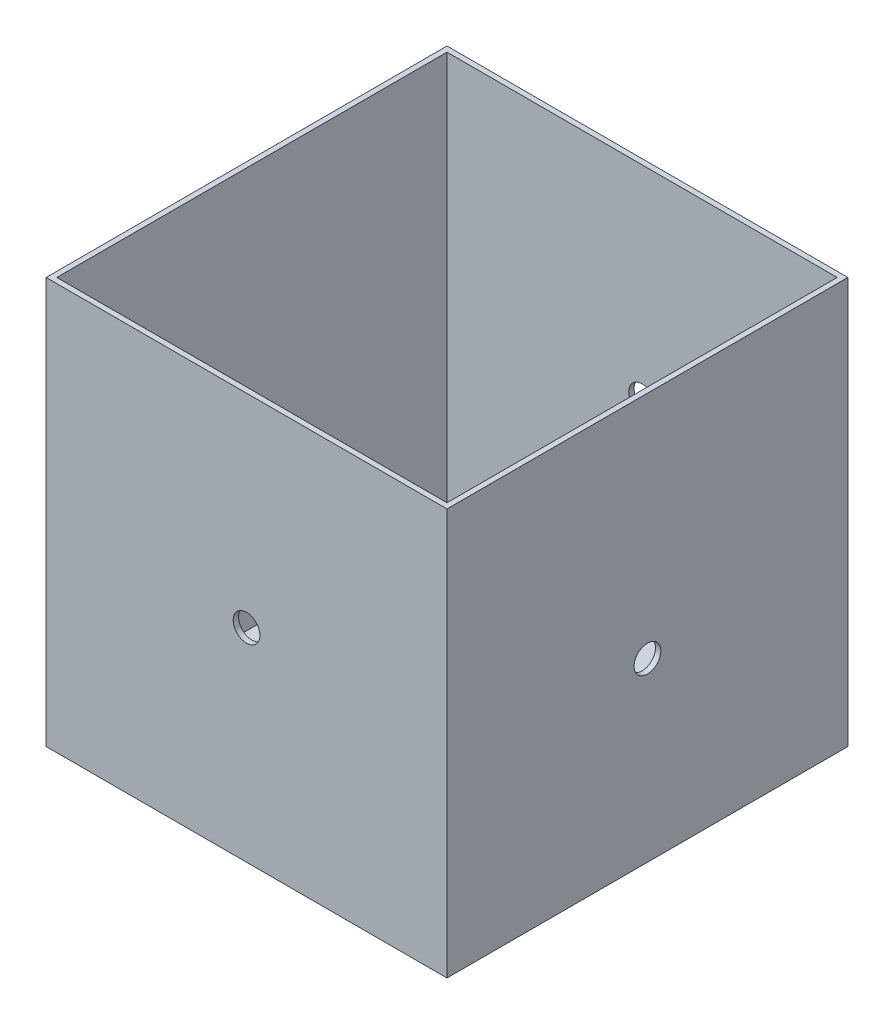
ISO-10303-21;
HEADER;
FILE_DESCRIPTION(('STEP AP214'),'2;1');
FILE_NAME('part.step','',(''),(''),'','','');
FILE_SCHEMA(('AUTOMOTIVE_DESIGN { 1 0 10303 214 1 1 1 1 }'));
ENDSEC;
DATA;
#1=APPLICATION_CONTEXT('core data for automotive mechanical design processes');
#2=APPLICATION_PROTOCOL_DEFINITION('international standard','automotive_design',2000,#1);
#3=PRODUCT_CONTEXT('',#1,'mechanical');
#4=PRODUCT('Part','Part','',(#3));
#5=PRODUCT_RELATED_PRODUCT_CATEGORY('part','',(#4));
#6=PRODUCT_DEFINITION_FORMATION('','',#4);
#7=PRODUCT_DEFINITION_CONTEXT('part definition',#1,'design');
#8=PRODUCT_DEFINITION('design','',#6,#7);
#9=PRODUCT_DEFINITION_SHAPE('','',#8);
#10=(LENGTH_UNIT() NAMED_UNIT(*) SI_UNIT(.MILLI.,.METRE.));
#11=(NAMED_UNIT(*) PLANE_ANGLE_UNIT() SI_UNIT($,.RADIAN.));
#12=(NAMED_UNIT(*) SI_UNIT($,.STERADIAN.) SOLID_ANGLE_UNIT());
#13=UNCERTAINTY_MEASURE_WITH_UNIT(LENGTH_MEASURE(1.E-05),#10,'distance_accuracy_value','');
#14=(GEOMETRIC_REPRESENTATION_CONTEXT(3) GLOBAL_UNCERTAINTY_ASSIGNED_CONTEXT((#13)) GLOBAL_UNIT_ASSIGNED_CONTEXT((#10,
#11,#12)) REPRESENTATION_CONTEXT('',''));
#15=CARTESIAN_POINT('',(0.,0.,0.));
#16=DIRECTION('',(0.,0.,1.));
#17=DIRECTION('',(1.,0.,0.));
#18=AXIS2_PLACEMENT_3D('',#15,#16,#17);
#19=CARTESIAN_POINT('',(75.,0.5,75.));
#20=DIRECTION('',(-1.,0.,0.));
#21=DIRECTION('',(0.,0.,1.));
#22=AXIS2_PLACEMENT_3D('',#19,#20,#21);
#23=PLANE('',#22);
#24=CARTESIAN_POINT('',(75.,64.5,0.));
#25=DIRECTION('',(-1.,0.,0.));
#26=DIRECTION('',(0.,0.,1.));
#27=AXIS2_PLACEMENT_3D('',#24,#25,#26);
#28=CIRCLE('',#27,5.);
#29=CARTESIAN_POINT('',(75.,64.5,5.));
#30=VERTEX_POINT('',#29);
#31=EDGE_CURVE('E189',#30,#30,#28,.T.);
#32=ORIENTED_EDGE('',*,*,#31,.T.);
#33=EDGE_LOOP('',(#32));
#34=FACE_BOUND('',#33,.T.);
#35=DIRECTION('',(0.,-1.,0.));
#36=VECTOR('',#35,1.);
#37=CARTESIAN_POINT('',(75.,0.5,75.));
#38=LINE('',#37,#36);
#39=CARTESIAN_POINT('',(75.,150.5,75.));
#40=VERTEX_POINT('',#39);
#41=CARTESIAN_POINT('',(75.,-1.5,75.));
#42=VERTEX_POINT('',#41);
#43=EDGE_CURVE('E170',#40,#42,#38,.T.);
#44=ORIENTED_EDGE('',*,*,#43,.T.);
#45=DIRECTION('',(0.,0.,1.));
#46=VECTOR('',#45,1.);
#47=CARTESIAN_POINT('',(75.,-1.5,75.));
#48=LINE('',#47,#46);
#49=CARTESIAN_POINT('',(75.,-1.5,-75.));
#50=VERTEX_POINT('',#49);
#51=EDGE_CURVE('E117',#50,#42,#48,.T.);
#52=ORIENTED_EDGE('',*,*,#51,.F.);
#53=DIRECTION('',(0.,-1.,0.));
#54=VECTOR('',#53,1.);
#55=CARTESIAN_POINT('',(75.,0.5,-75.));
#56=LINE('',#55,#54);
#57=CARTESIAN_POINT('',(75.,150.5,-75.));
#58=VERTEX_POINT('',#57);
#59=EDGE_CURVE('E11',#58,#50,#56,.T.);
#60=ORIENTED_EDGE('',*,*,#59,.F.);
#61=DIRECTION('',(0.,0.,-1.));
#62=VECTOR('',#61,1.);
#63=CARTESIAN_POINT('',(75.,150.5,-75.));
#64=LINE('',#63,#62);
#65=EDGE_CURVE('E142',#40,#58,#64,.T.);
#66=ORIENTED_EDGE('',*,*,#65,.F.);
#67=EDGE_LOOP('',(#44,#52,#60,#66));
#68=FACE_BOUND('',#67,.T.);
#69=ADVANCED_FACE('F34',(#34,#68),#23,.F.);
#70=CARTESIAN_POINT('',(-75.,0.5,-75.));
#71=DIRECTION('',(0.,0.,1.));
#72=DIRECTION('',(1.,0.,0.));
#73=AXIS2_PLACEMENT_3D('',#70,#71,#72);
#74=PLANE('',#73);
#75=CARTESIAN_POINT('',(0.,74.5,-75.));
#76=DIRECTION('',(0.,0.,-1.));
#77=DIRECTION('',(-1.,0.,0.));
#78=AXIS2_PLACEMENT_3D('',#75,#76,#77);
#79=CIRCLE('',#78,5.);
#80=CARTESIAN_POINT('',(-5.,74.5,-75.));
#81=VERTEX_POINT('',#80);
#82=EDGE_CURVE('E177',#81,#81,#79,.T.);
#83=ORIENTED_EDGE('',*,*,#82,.F.);
#84=EDGE_LOOP('',(#83));
#85=FACE_BOUND('',#84,.T.);
#86=ORIENTED_EDGE('',*,*,#59,.T.);
#87=DIRECTION('',(1.,0.,0.));
#88=VECTOR('',#87,1.);
#89=CARTESIAN_POINT('',(75.,-1.5,-75.));
#90=LINE('',#89,#88);
#91=CARTESIAN_POINT('',(-75.,-1.5,-75.));
#92=VERTEX_POINT('',#91);
#93=EDGE_CURVE('E112',#92,#50,#90,.T.);
#94=ORIENTED_EDGE('',*,*,#93,.F.);
#95=DIRECTION('',(0.,-1.,0.));
#96=VECTOR('',#95,1.);
#97=CARTESIAN_POINT('',(-75.,0.5,-75.));
#98=LINE('',#97,#96);
#99=CARTESIAN_POINT('',(-75.,150.5,-75.));
#100=VERTEX_POINT('',#99);
#101=EDGE_CURVE('E42',#100,#92,#98,.T.);
#102=ORIENTED_EDGE('',*,*,#101,.F.);
#103=DIRECTION('',(-1.,0.,0.));
#104=VECTOR('',#103,1.);
#105=CARTESIAN_POINT('',(-75.,150.5,-75.));
#106=LINE('',#105,#104);
#107=EDGE_CURVE('E145',#58,#100,#106,.T.);
#108=ORIENTED_EDGE('',*,*,#107,.F.);
#109=EDGE_LOOP('',(#86,#94,#102,#108));
#110=FACE_BOUND('',#109,.T.);
#111=ADVANCED_FACE('F113',(#85,#110),#74,.F.);
#112=CARTESIAN_POINT('',(-75.,0.5,75.));
#113=DIRECTION('',(1.,0.,0.));
#114=DIRECTION('',(0.,0.,-1.));
#115=AXIS2_PLACEMENT_3D('',#112,#113,#114);
#116=PLANE('',#115);
#117=CARTESIAN_POINT('',(-75.,64.5,0.));
#118=DIRECTION('',(-1.,0.,0.));
#119=DIRECTION('',(0.,0.,1.));
#120=AXIS2_PLACEMENT_3D('',#117,#118,#119);
#121=CIRCLE('',#120,5.);
#122=CARTESIAN_POINT('',(-75.,64.5,5.));
#123=VERTEX_POINT('',#122);
#124=EDGE_CURVE('E186',#123,#123,#121,.T.);
#125=ORIENTED_EDGE('',*,*,#124,.F.);
#126=EDGE_LOOP('',(#125));
#127=FACE_BOUND('',#126,.T.);
#128=ORIENTED_EDGE('',*,*,#101,.T.);
#129=DIRECTION('',(0.,0.,-1.));
#130=VECTOR('',#129,1.);
#131=CARTESIAN_POINT('',(-75.,-1.5,75.));
#132=LINE('',#131,#130);
#133=CARTESIAN_POINT('',(-75.,-1.5,75.));
#134=VERTEX_POINT('',#133);
#135=EDGE_CURVE('E103',#134,#92,#132,.T.);
#136=ORIENTED_EDGE('',*,*,#135,.F.);
#137=DIRECTION('',(0.,-1.,0.));
#138=VECTOR('',#137,1.);
#139=CARTESIAN_POINT('',(-75.,0.5,75.));
#140=LINE('',#139,#138);
#141=CARTESIAN_POINT('',(-75.,150.5,75.));
#142=VERTEX_POINT('',#141);
#143=EDGE_CURVE('E109',#142,#134,#140,.T.);
#144=ORIENTED_EDGE('',*,*,#143,.F.);
#145=DIRECTION('',(0.,0.,1.));
#146=VECTOR('',#145,1.);
#147=CARTESIAN_POINT('',(-75.,150.5,-75.));
#148=LINE('',#147,#146);
#149=EDGE_CURVE('E105',#100,#142,#148,.T.);
#150=ORIENTED_EDGE('',*,*,#149,.F.);
#151=EDGE_LOOP('',(#128,#136,#144,#150));
#152=FACE_BOUND('',#151,.T.);
#153=ADVANCED_FACE('F101',(#127,#152),#116,.F.);
#154=CARTESIAN_POINT('',(-75.,0.5,75.));
#155=DIRECTION('',(0.,0.,-1.));
#156=DIRECTION('',(-1.,0.,0.));
#157=AXIS2_PLACEMENT_3D('',#154,#155,#156);
#158=PLANE('',#157);
#159=CARTESIAN_POINT('',(0.,74.5,75.));
#160=DIRECTION('',(0.,0.,-1.));
#161=DIRECTION('',(-1.,0.,0.));
#162=AXIS2_PLACEMENT_3D('',#159,#160,#161);
#163=CIRCLE('',#162,5.);
#164=CARTESIAN_POINT('',(-5.,74.5,75.));
#165=VERTEX_POINT('',#164);
#166=EDGE_CURVE('E173',#165,#165,#163,.T.);
#167=ORIENTED_EDGE('',*,*,#166,.T.);
#168=EDGE_LOOP('',(#167));
#169=FACE_BOUND('',#168,.T.);
#170=ORIENTED_EDGE('',*,*,#143,.T.);
#171=DIRECTION('',(-1.,0.,0.));
#172=VECTOR('',#171,1.);
#173=CARTESIAN_POINT('',(75.,-1.5,75.));
#174=LINE('',#173,#172);
#175=EDGE_CURVE('E122',#42,#134,#174,.T.);
#176=ORIENTED_EDGE('',*,*,#175,.F.);
#177=ORIENTED_EDGE('',*,*,#43,.F.);
#178=DIRECTION('',(1.,0.,0.));
#179=VECTOR('',#178,1.);
#180=CARTESIAN_POINT('',(-75.,150.5,75.));
#181=LINE('',#180,#179);
#182=EDGE_CURVE('E148',#142,#40,#181,.T.);
#183=ORIENTED_EDGE('',*,*,#182,.F.);
#184=EDGE_LOOP('',(#170,#176,#177,#183));
#185=FACE_BOUND('',#184,.T.);
#186=ADVANCED_FACE('F233',(#169,#185),#158,.F.);
#187=CARTESIAN_POINT('',(0.,150.5,0.));
#188=DIRECTION('',(0.,1.,0.));
#189=DIRECTION('',(0.,0.,1.));
#190=AXIS2_PLACEMENT_3D('',#187,#188,#189);
#191=PLANE('',#190);
#192=ORIENTED_EDGE('',*,*,#65,.T.);
#193=ORIENTED_EDGE('',*,*,#107,.T.);
#194=ORIENTED_EDGE('',*,*,#149,.T.);
#195=ORIENTED_EDGE('',*,*,#182,.T.);
#196=EDGE_LOOP('',(#192,#193,#194,#195));
#197=FACE_BOUND('',#196,.T.);
#198=DIRECTION('',(-1.,0.,0.));
#199=VECTOR('',#198,1.);
#200=CARTESIAN_POINT('',(-73.,150.5,-73.));
#201=LINE('',#200,#199);
#202=CARTESIAN_POINT('',(73.,150.5,-73.));
#203=VERTEX_POINT('',#202);
#204=CARTESIAN_POINT('',(-73.,150.5,-73.));
#205=VERTEX_POINT('',#204);
#206=EDGE_CURVE('E134',#203,#205,#201,.T.);
#207=ORIENTED_EDGE('',*,*,#206,.F.);
#208=DIRECTION('',(0.,0.,-1.));
#209=VECTOR('',#208,1.);
#210=CARTESIAN_POINT('',(73.,150.5,-73.));
#211=LINE('',#210,#209);
#212=CARTESIAN_POINT('',(73.,150.5,73.));
#213=VERTEX_POINT('',#212);
#214=EDGE_CURVE('E132',#213,#203,#211,.T.);
#215=ORIENTED_EDGE('',*,*,#214,.F.);
#216=DIRECTION('',(1.,0.,0.));
#217=VECTOR('',#216,1.);
#218=CARTESIAN_POINT('',(-73.,150.5,73.));
#219=LINE('',#218,#217);
#220=CARTESIAN_POINT('',(-73.,150.5,73.));
#221=VERTEX_POINT('',#220);
#222=EDGE_CURVE('E139',#221,#213,#219,.T.);
#223=ORIENTED_EDGE('',*,*,#222,.F.);
#224=DIRECTION('',(0.,0.,1.));
#225=VECTOR('',#224,1.);
#226=CARTESIAN_POINT('',(-73.,150.5,-73.));
#227=LINE('',#226,#225);
#228=EDGE_CURVE('E136',#205,#221,#227,.T.);
#229=ORIENTED_EDGE('',*,*,#228,.F.);
#230=EDGE_LOOP('',(#207,#215,#223,#229));
#231=FACE_BOUND('',#230,.T.);
#232=ADVANCED_FACE('F213',(#197,#231),#191,.T.);
#233=CARTESIAN_POINT('',(0.,0.5,0.));
#234=DIRECTION('',(0.,-1.,0.));
#235=DIRECTION('',(0.,0.,-1.));
#236=AXIS2_PLACEMENT_3D('',#233,#234,#235);
#237=PLANE('',#236);
#238=DIRECTION('',(-1.,0.,0.));
#239=VECTOR('',#238,1.);
#240=CARTESIAN_POINT('',(73.,0.5,-73.));
#241=LINE('',#240,#239);
#242=CARTESIAN_POINT('',(73.,0.5,-73.));
#243=VERTEX_POINT('',#242);
#244=CARTESIAN_POINT('',(-73.,0.5,-73.));
#245=VERTEX_POINT('',#244);
#246=EDGE_CURVE('E160',#243,#245,#241,.T.);
#247=ORIENTED_EDGE('',*,*,#246,.T.);
#248=DIRECTION('',(0.,0.,1.));
#249=VECTOR('',#248,1.);
#250=CARTESIAN_POINT('',(-73.,0.5,73.));
#251=LINE('',#250,#249);
#252=CARTESIAN_POINT('',(-73.,0.5,73.));
#253=VERTEX_POINT('',#252);
#254=EDGE_CURVE('E151',#245,#253,#251,.T.);
#255=ORIENTED_EDGE('',*,*,#254,.T.);
#256=DIRECTION('',(1.,0.,0.));
#257=VECTOR('',#256,1.);
#258=CARTESIAN_POINT('',(73.,0.5,73.));
#259=LINE('',#258,#257);
#260=CARTESIAN_POINT('',(73.,0.5,73.));
#261=VERTEX_POINT('',#260);
#262=EDGE_CURVE('E154',#253,#261,#259,.T.);
#263=ORIENTED_EDGE('',*,*,#262,.T.);
#264=DIRECTION('',(0.,0.,-1.));
#265=VECTOR('',#264,1.);
#266=CARTESIAN_POINT('',(73.,0.5,73.));
#267=LINE('',#266,#265);
#268=EDGE_CURVE('E157',#261,#243,#267,.T.);
#269=ORIENTED_EDGE('',*,*,#268,.T.);
#270=EDGE_LOOP('',(#247,#255,#263,#269));
#271=FACE_BOUND('',#270,.T.);
#272=ADVANCED_FACE('F206',(#271),#237,.F.);
#273=CARTESIAN_POINT('',(73.,15.5,73.));
#274=DIRECTION('',(-1.,0.,0.));
#275=DIRECTION('',(0.,0.,1.));
#276=AXIS2_PLACEMENT_3D('',#273,#274,#275);
#277=PLANE('',#276);
#278=CARTESIAN_POINT('',(73.,64.5,0.));
#279=DIRECTION('',(-1.,0.,0.));
#280=DIRECTION('',(0.,0.,1.));
#281=AXIS2_PLACEMENT_3D('',#278,#279,#280);
#282=CIRCLE('',#281,5.);
#283=CARTESIAN_POINT('',(73.,64.5,5.));
#284=VERTEX_POINT('',#283);
#285=EDGE_CURVE('E182',#284,#284,#282,.T.);
#286=ORIENTED_EDGE('',*,*,#285,.F.);
#287=EDGE_LOOP('',(#286));
#288=FACE_BOUND('',#287,.T.);
#289=ORIENTED_EDGE('',*,*,#268,.F.);
#290=DIRECTION('',(0.,-1.,0.));
#291=VECTOR('',#290,1.);
#292=CARTESIAN_POINT('',(73.,15.5,73.));
#293=LINE('',#292,#291);
#294=EDGE_CURVE('E165',#213,#261,#293,.T.);
#295=ORIENTED_EDGE('',*,*,#294,.F.);
#296=ORIENTED_EDGE('',*,*,#214,.T.);
#297=DIRECTION('',(0.,-1.,0.));
#298=VECTOR('',#297,1.);
#299=CARTESIAN_POINT('',(73.,15.5,-73.));
#300=LINE('',#299,#298);
#301=EDGE_CURVE('E58',#203,#243,#300,.T.);
#302=ORIENTED_EDGE('',*,*,#301,.T.);
#303=EDGE_LOOP('',(#289,#295,#296,#302));
#304=FACE_BOUND('',#303,.T.);
#305=ADVANCED_FACE('F210',(#288,#304),#277,.T.);
#306=CARTESIAN_POINT('',(73.,15.5,-73.));
#307=DIRECTION('',(0.,0.,1.));
#308=DIRECTION('',(1.,0.,0.));
#309=AXIS2_PLACEMENT_3D('',#306,#307,#308);
#310=PLANE('',#309);
#311=CARTESIAN_POINT('',(0.,74.5,-73.));
#312=DIRECTION('',(0.,0.,1.));
#313=DIRECTION('',(1.,0.,0.));
#314=AXIS2_PLACEMENT_3D('',#311,#312,#313);
#315=CIRCLE('',#314,5.);
#316=CARTESIAN_POINT('',(5.,74.5,-73.));
#317=VERTEX_POINT('',#316);
#318=EDGE_CURVE('E123',#317,#317,#315,.T.);
#319=ORIENTED_EDGE('',*,*,#318,.F.);
#320=EDGE_LOOP('',(#319));
#321=FACE_BOUND('',#320,.T.);
#322=ORIENTED_EDGE('',*,*,#246,.F.);
#323=ORIENTED_EDGE('',*,*,#301,.F.);
#324=ORIENTED_EDGE('',*,*,#206,.T.);
#325=DIRECTION('',(0.,-1.,0.));
#326=VECTOR('',#325,1.);
#327=CARTESIAN_POINT('',(-73.,15.5,-73.));
#328=LINE('',#327,#326);
#329=EDGE_CURVE('E50',#205,#245,#328,.T.);
#330=ORIENTED_EDGE('',*,*,#329,.T.);
#331=EDGE_LOOP('',(#322,#323,#324,#330));
#332=FACE_BOUND('',#331,.T.);
#333=ADVANCED_FACE('F203',(#321,#332),#310,.T.);
#334=CARTESIAN_POINT('',(-73.,15.5,73.));
#335=DIRECTION('',(1.,0.,0.));
#336=DIRECTION('',(0.,0.,-1.));
#337=AXIS2_PLACEMENT_3D('',#334,#335,#336);
#338=PLANE('',#337);
#339=CARTESIAN_POINT('',(-73.,64.5,0.));
#340=DIRECTION('',(1.,0.,0.));
#341=DIRECTION('',(0.,0.,-1.));
#342=AXIS2_PLACEMENT_3D('',#339,#340,#341);
#343=CIRCLE('',#342,5.);
#344=CARTESIAN_POINT('',(-73.,64.5,-5.));
#345=VERTEX_POINT('',#344);
#346=EDGE_CURVE('E37',#345,#345,#343,.T.);
#347=ORIENTED_EDGE('',*,*,#346,.F.);
#348=EDGE_LOOP('',(#347));
#349=FACE_BOUND('',#348,.T.);
#350=ORIENTED_EDGE('',*,*,#254,.F.);
#351=ORIENTED_EDGE('',*,*,#329,.F.);
#352=ORIENTED_EDGE('',*,*,#228,.T.);
#353=DIRECTION('',(0.,-1.,0.));
#354=VECTOR('',#353,1.);
#355=CARTESIAN_POINT('',(-73.,15.5,73.));
#356=LINE('',#355,#354);
#357=EDGE_CURVE('E167',#221,#253,#356,.T.);
#358=ORIENTED_EDGE('',*,*,#357,.T.);
#359=EDGE_LOOP('',(#350,#351,#352,#358));
#360=FACE_BOUND('',#359,.T.);
#361=ADVANCED_FACE('F199',(#349,#360),#338,.T.);
#362=CARTESIAN_POINT('',(73.,15.5,73.));
#363=DIRECTION('',(0.,0.,-1.));
#364=DIRECTION('',(-1.,0.,0.));
#365=AXIS2_PLACEMENT_3D('',#362,#363,#364);
#366=PLANE('',#365);
#367=CARTESIAN_POINT('',(0.,74.5,73.));
#368=DIRECTION('',(0.,0.,-1.));
#369=DIRECTION('',(-1.,0.,0.));
#370=AXIS2_PLACEMENT_3D('',#367,#368,#369);
#371=CIRCLE('',#370,5.);
#372=CARTESIAN_POINT('',(-5.,74.5,73.));
#373=VERTEX_POINT('',#372);
#374=EDGE_CURVE('E126',#373,#373,#371,.T.);
#375=ORIENTED_EDGE('',*,*,#374,.F.);
#376=EDGE_LOOP('',(#375));
#377=FACE_BOUND('',#376,.T.);
#378=ORIENTED_EDGE('',*,*,#262,.F.);
#379=ORIENTED_EDGE('',*,*,#357,.F.);
#380=ORIENTED_EDGE('',*,*,#222,.T.);
#381=ORIENTED_EDGE('',*,*,#294,.T.);
#382=EDGE_LOOP('',(#378,#379,#380,#381));
#383=FACE_BOUND('',#382,.T.);
#384=ADVANCED_FACE('F202',(#377,#383),#366,.T.);
#385=CARTESIAN_POINT('',(0.,-1.5,0.));
#386=DIRECTION('',(0.,1.,0.));
#387=DIRECTION('',(0.,0.,1.));
#388=AXIS2_PLACEMENT_3D('',#385,#386,#387);
#389=PLANE('',#388);
#390=ORIENTED_EDGE('',*,*,#135,.T.);
#391=ORIENTED_EDGE('',*,*,#93,.T.);
#392=ORIENTED_EDGE('',*,*,#51,.T.);
#393=ORIENTED_EDGE('',*,*,#175,.T.);
#394=EDGE_LOOP('',(#390,#391,#392,#393));
#395=FACE_BOUND('',#394,.T.);
#396=ADVANCED_FACE('F120',(#395),#389,.F.);
#397=CARTESIAN_POINT('',(0.,74.5,75.));
#398=DIRECTION('',(0.,0.,-1.));
#399=DIRECTION('',(-1.,0.,0.));
#400=AXIS2_PLACEMENT_3D('',#397,#398,#399);
#401=CYLINDRICAL_SURFACE('',#400,5.);
#402=ORIENTED_EDGE('',*,*,#374,.T.);
#403=EDGE_LOOP('',(#402));
#404=FACE_BOUND('',#403,.T.);
#405=ORIENTED_EDGE('',*,*,#166,.F.);
#406=EDGE_LOOP('',(#405));
#407=FACE_BOUND('',#406,.T.);
#408=ADVANCED_FACE('F221',(#404,#407),#401,.F.);
#409=ORIENTED_EDGE('',*,*,#318,.T.);
#410=EDGE_LOOP('',(#409));
#411=FACE_BOUND('',#410,.T.);
#412=ORIENTED_EDGE('',*,*,#82,.T.);
#413=EDGE_LOOP('',(#412));
#414=FACE_BOUND('',#413,.T.);
#415=ADVANCED_FACE('F260',(#411,#414),#401,.F.);
#416=CARTESIAN_POINT('',(75.,64.5,0.));
#417=DIRECTION('',(-1.,0.,0.));
#418=DIRECTION('',(0.,0.,1.));
#419=AXIS2_PLACEMENT_3D('',#416,#417,#418);
#420=CYLINDRICAL_SURFACE('',#419,5.);
#421=ORIENTED_EDGE('',*,*,#346,.T.);
#422=EDGE_LOOP('',(#421));
#423=FACE_BOUND('',#422,.T.);
#424=ORIENTED_EDGE('',*,*,#124,.T.);
#425=EDGE_LOOP('',(#424));
#426=FACE_BOUND('',#425,.T.);
#427=ADVANCED_FACE('F196',(#423,#426),#420,.F.);
#428=ORIENTED_EDGE('',*,*,#285,.T.);
#429=EDGE_LOOP('',(#428));
#430=FACE_BOUND('',#429,.T.);
#431=ORIENTED_EDGE('',*,*,#31,.F.);
#432=EDGE_LOOP('',(#431));
#433=FACE_BOUND('',#432,.T.);
#434=ADVANCED_FACE('F253',(#430,#433),#420,.F.);
#435=CLOSED_SHELL('',(#69,#111,#153,#186,#232,#272,#305,#333,#361,#384,#396,#408,#415,#427,#434));
#436=MANIFOLD_SOLID_BREP('B2',#435);
#437=ADVANCED_BREP_SHAPE_REPRESENTATION('',(#18,#436),#14);
#438=SHAPE_DEFINITION_REPRESENTATION(#9,#437);
ENDSEC;
END-ISO-10303-21;
